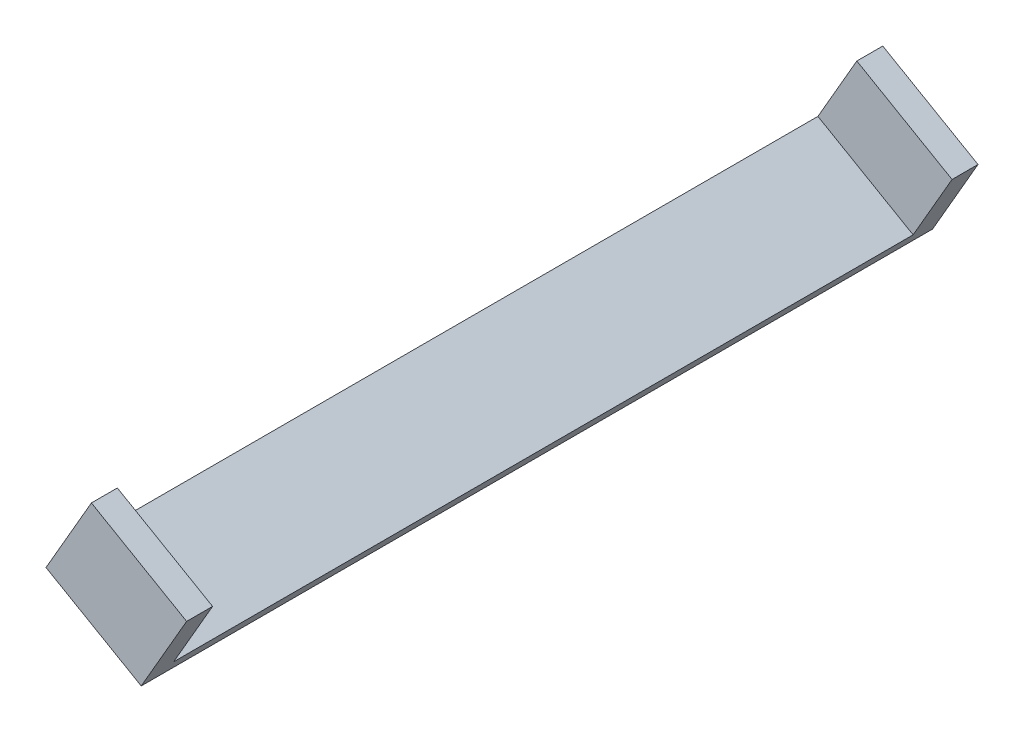
ISO-10303-21;
HEADER;
FILE_DESCRIPTION(('STEP AP214'),'2;1');
FILE_NAME('part.step','',(''),(''),'','','');
FILE_SCHEMA(('AUTOMOTIVE_DESIGN { 1 0 10303 214 1 1 1 1 }'));
ENDSEC;
DATA;
#1=APPLICATION_CONTEXT('core data for automotive mechanical design processes');
#2=APPLICATION_PROTOCOL_DEFINITION('international standard','automotive_design',2000,#1);
#3=PRODUCT_CONTEXT('',#1,'mechanical');
#4=PRODUCT('Part','Part','',(#3));
#5=PRODUCT_RELATED_PRODUCT_CATEGORY('part','',(#4));
#6=PRODUCT_DEFINITION_FORMATION('','',#4);
#7=PRODUCT_DEFINITION_CONTEXT('part definition',#1,'design');
#8=PRODUCT_DEFINITION('design','',#6,#7);
#9=PRODUCT_DEFINITION_SHAPE('','',#8);
#10=(LENGTH_UNIT() NAMED_UNIT(*) SI_UNIT(.MILLI.,.METRE.));
#11=(NAMED_UNIT(*) PLANE_ANGLE_UNIT() SI_UNIT($,.RADIAN.));
#12=(NAMED_UNIT(*) SI_UNIT($,.STERADIAN.) SOLID_ANGLE_UNIT());
#13=UNCERTAINTY_MEASURE_WITH_UNIT(LENGTH_MEASURE(1.E-05),#10,'distance_accuracy_value','');
#14=(GEOMETRIC_REPRESENTATION_CONTEXT(3) GLOBAL_UNCERTAINTY_ASSIGNED_CONTEXT((#13)) GLOBAL_UNIT_ASSIGNED_CONTEXT((#10,
#11,#12)) REPRESENTATION_CONTEXT('',''));
#15=CARTESIAN_POINT('',(0.,0.,0.));
#16=DIRECTION('',(0.,0.,1.));
#17=DIRECTION('',(1.,0.,0.));
#18=AXIS2_PLACEMENT_3D('',#15,#16,#17);
#19=CARTESIAN_POINT('',(-136.8,248.875527592725,1220.));
#20=DIRECTION('',(-0.499999999999998,-0.86602540378444,0.));
#21=DIRECTION('',(0.86602540378444,-0.499999999999998,0.));
#22=AXIS2_PLACEMENT_3D('',#19,#20,#21);
#23=PLANE('',#22);
#24=DIRECTION('',(0.86602540378444,-0.499999999999998,0.));
#25=VECTOR('',#24,1.);
#26=CARTESIAN_POINT('',(-136.8,248.875527592725,40.));
#27=LINE('',#26,#25);
#28=CARTESIAN_POINT('',(-136.8,248.875527592725,40.));
#29=VERTEX_POINT('',#28);
#30=CARTESIAN_POINT('',(9.99999999999997,164.120508075689,40.));
#31=VERTEX_POINT('',#30);
#32=EDGE_CURVE('E55',#29,#31,#27,.T.);
#33=ORIENTED_EDGE('',*,*,#32,.F.);
#34=DIRECTION('',(0.,0.,-1.));
#35=VECTOR('',#34,1.);
#36=CARTESIAN_POINT('',(-136.8,248.875527592725,1220.));
#37=LINE('',#36,#35);
#38=CARTESIAN_POINT('',(-136.8,248.875527592725,1180.));
#39=VERTEX_POINT('',#38);
#40=EDGE_CURVE('E123',#39,#29,#37,.T.);
#41=ORIENTED_EDGE('',*,*,#40,.F.);
#42=DIRECTION('',(-0.86602540378444,0.499999999999998,0.));
#43=VECTOR('',#42,1.);
#44=CARTESIAN_POINT('',(-136.8,248.875527592725,1180.));
#45=LINE('',#44,#43);
#46=CARTESIAN_POINT('',(9.99999999999998,164.120508075689,1180.));
#47=VERTEX_POINT('',#46);
#48=EDGE_CURVE('E124',#47,#39,#45,.T.);
#49=ORIENTED_EDGE('',*,*,#48,.F.);
#50=DIRECTION('',(0.,0.,-1.));
#51=VECTOR('',#50,1.);
#52=CARTESIAN_POINT('',(9.99999999999997,164.120508075689,1220.));
#53=LINE('',#52,#51);
#54=EDGE_CURVE('E45',#47,#31,#53,.T.);
#55=ORIENTED_EDGE('',*,*,#54,.T.);
#56=EDGE_LOOP('',(#33,#41,#49,#55));
#57=FACE_BOUND('',#56,.T.);
#58=ADVANCED_FACE('F37',(#57),#23,.F.);
#59=CARTESIAN_POINT('',(0.,146.8,1220.));
#60=DIRECTION('',(0.499999999999998,0.86602540378444,0.));
#61=DIRECTION('',(-0.86602540378444,0.499999999999998,0.));
#62=AXIS2_PLACEMENT_3D('',#59,#60,#61);
#63=PLANE('',#62);
#64=DIRECTION('',(0.86602540378444,-0.499999999999998,0.));
#65=VECTOR('',#64,1.);
#66=CARTESIAN_POINT('',(0.,146.8,0.));
#67=LINE('',#66,#65);
#68=CARTESIAN_POINT('',(-146.8,231.555019517037,0.));
#69=VERTEX_POINT('',#68);
#70=CARTESIAN_POINT('',(0.,146.8,0.));
#71=VERTEX_POINT('',#70);
#72=EDGE_CURVE('E144',#69,#71,#67,.T.);
#73=ORIENTED_EDGE('',*,*,#72,.T.);
#74=DIRECTION('',(0.,0.,-1.));
#75=VECTOR('',#74,1.);
#76=CARTESIAN_POINT('',(0.,146.8,1220.));
#77=LINE('',#76,#75);
#78=CARTESIAN_POINT('',(0.,146.8,1220.));
#79=VERTEX_POINT('',#78);
#80=EDGE_CURVE('E11',#79,#71,#77,.T.);
#81=ORIENTED_EDGE('',*,*,#80,.F.);
#82=DIRECTION('',(0.86602540378444,-0.499999999999998,0.));
#83=VECTOR('',#82,1.);
#84=CARTESIAN_POINT('',(0.,146.8,1220.));
#85=LINE('',#84,#83);
#86=CARTESIAN_POINT('',(-146.8,231.555019517037,1220.));
#87=VERTEX_POINT('',#86);
#88=EDGE_CURVE('E145',#87,#79,#85,.T.);
#89=ORIENTED_EDGE('',*,*,#88,.F.);
#90=DIRECTION('',(0.,0.,-1.));
#91=VECTOR('',#90,1.);
#92=CARTESIAN_POINT('',(-146.8,231.555019517037,1220.));
#93=LINE('',#92,#91);
#94=EDGE_CURVE('E153',#87,#69,#93,.T.);
#95=ORIENTED_EDGE('',*,*,#94,.T.);
#96=EDGE_LOOP('',(#73,#81,#89,#95));
#97=FACE_BOUND('',#96,.T.);
#98=ADVANCED_FACE('F39',(#97),#63,.F.);
#99=CARTESIAN_POINT('',(0.,146.8,1220.));
#100=DIRECTION('',(-0.86602540378444,0.499999999999998,0.));
#101=DIRECTION('',(-0.499999999999998,-0.86602540378444,0.));
#102=AXIS2_PLACEMENT_3D('',#99,#100,#101);
#103=PLANE('',#102);
#104=DIRECTION('',(0.499999999999998,0.86602540378444,0.));
#105=VECTOR('',#104,1.);
#106=CARTESIAN_POINT('',(0.,146.8,0.));
#107=LINE('',#106,#105);
#108=CARTESIAN_POINT('',(69.9999999999997,268.043556529822,0.));
#109=VERTEX_POINT('',#108);
#110=EDGE_CURVE('E156',#71,#109,#107,.T.);
#111=ORIENTED_EDGE('',*,*,#110,.T.);
#112=DIRECTION('',(0.,0.,-1.));
#113=VECTOR('',#112,1.);
#114=CARTESIAN_POINT('',(69.9999999999997,268.043556529822,0.));
#115=LINE('',#114,#113);
#116=CARTESIAN_POINT('',(69.9999999999997,268.043556529822,40.));
#117=VERTEX_POINT('',#116);
#118=EDGE_CURVE('E111',#117,#109,#115,.T.);
#119=ORIENTED_EDGE('',*,*,#118,.F.);
#120=DIRECTION('',(-0.499999999999998,-0.86602540378444,0.));
#121=VECTOR('',#120,1.);
#122=CARTESIAN_POINT('',(69.9999999999997,268.043556529822,40.));
#123=LINE('',#122,#121);
#124=EDGE_CURVE('E107',#117,#31,#123,.T.);
#125=ORIENTED_EDGE('',*,*,#124,.T.);
#126=ORIENTED_EDGE('',*,*,#54,.F.);
#127=DIRECTION('',(-0.499999999999998,-0.86602540378444,0.));
#128=VECTOR('',#127,1.);
#129=CARTESIAN_POINT('',(69.9999999999997,268.043556529822,1180.));
#130=LINE('',#129,#128);
#131=CARTESIAN_POINT('',(69.9999999999997,268.043556529822,1180.));
#132=VERTEX_POINT('',#131);
#133=EDGE_CURVE('E142',#132,#47,#130,.T.);
#134=ORIENTED_EDGE('',*,*,#133,.F.);
#135=DIRECTION('',(0.,0.,-1.));
#136=VECTOR('',#135,1.);
#137=CARTESIAN_POINT('',(69.9999999999997,268.043556529822,1220.));
#138=LINE('',#137,#136);
#139=CARTESIAN_POINT('',(69.9999999999997,268.043556529822,1220.));
#140=VERTEX_POINT('',#139);
#141=EDGE_CURVE('E136',#140,#132,#138,.T.);
#142=ORIENTED_EDGE('',*,*,#141,.F.);
#143=DIRECTION('',(0.499999999999998,0.86602540378444,0.));
#144=VECTOR('',#143,1.);
#145=CARTESIAN_POINT('',(0.,146.8,1220.));
#146=LINE('',#145,#144);
#147=EDGE_CURVE('E148',#79,#140,#146,.T.);
#148=ORIENTED_EDGE('',*,*,#147,.F.);
#149=ORIENTED_EDGE('',*,*,#80,.T.);
#150=EDGE_LOOP('',(#111,#119,#125,#126,#134,#142,#148,#149));
#151=FACE_BOUND('',#150,.T.);
#152=ADVANCED_FACE('F169',(#151),#103,.F.);
#153=CARTESIAN_POINT('',(-146.8,231.555019517037,1220.));
#154=DIRECTION('',(0.86602540378444,-0.499999999999998,0.));
#155=DIRECTION('',(0.499999999999998,0.86602540378444,0.));
#156=AXIS2_PLACEMENT_3D('',#153,#154,#155);
#157=PLANE('',#156);
#158=DIRECTION('',(-0.499999999999998,-0.86602540378444,0.));
#159=VECTOR('',#158,1.);
#160=CARTESIAN_POINT('',(-146.8,231.555019517037,0.));
#161=LINE('',#160,#159);
#162=CARTESIAN_POINT('',(-76.8000000000003,352.798576046858,0.));
#163=VERTEX_POINT('',#162);
#164=EDGE_CURVE('E149',#163,#69,#161,.T.);
#165=ORIENTED_EDGE('',*,*,#164,.T.);
#166=ORIENTED_EDGE('',*,*,#94,.F.);
#167=DIRECTION('',(-0.499999999999998,-0.86602540378444,0.));
#168=VECTOR('',#167,1.);
#169=CARTESIAN_POINT('',(-146.8,231.555019517037,1220.));
#170=LINE('',#169,#168);
#171=CARTESIAN_POINT('',(-76.8000000000003,352.798576046858,1220.));
#172=VERTEX_POINT('',#171);
#173=EDGE_CURVE('E151',#172,#87,#170,.T.);
#174=ORIENTED_EDGE('',*,*,#173,.F.);
#175=DIRECTION('',(0.,0.,1.));
#176=VECTOR('',#175,1.);
#177=CARTESIAN_POINT('',(-76.8000000000003,352.798576046858,1220.));
#178=LINE('',#177,#176);
#179=CARTESIAN_POINT('',(-76.8000000000003,352.798576046858,1180.));
#180=VERTEX_POINT('',#179);
#181=EDGE_CURVE('E126',#180,#172,#178,.T.);
#182=ORIENTED_EDGE('',*,*,#181,.F.);
#183=DIRECTION('',(-0.499999999999998,-0.86602540378444,0.));
#184=VECTOR('',#183,1.);
#185=CARTESIAN_POINT('',(-76.8000000000003,352.798576046858,1180.));
#186=LINE('',#185,#184);
#187=EDGE_CURVE('E139',#180,#39,#186,.T.);
#188=ORIENTED_EDGE('',*,*,#187,.T.);
#189=ORIENTED_EDGE('',*,*,#40,.T.);
#190=DIRECTION('',(-0.499999999999998,-0.86602540378444,0.));
#191=VECTOR('',#190,1.);
#192=CARTESIAN_POINT('',(-76.8000000000003,352.798576046858,40.));
#193=LINE('',#192,#191);
#194=CARTESIAN_POINT('',(-76.8000000000003,352.798576046858,40.));
#195=VERTEX_POINT('',#194);
#196=EDGE_CURVE('E105',#195,#29,#193,.T.);
#197=ORIENTED_EDGE('',*,*,#196,.F.);
#198=DIRECTION('',(0.,0.,1.));
#199=VECTOR('',#198,1.);
#200=CARTESIAN_POINT('',(-76.8000000000003,352.798576046858,0.));
#201=LINE('',#200,#199);
#202=EDGE_CURVE('E112',#163,#195,#201,.T.);
#203=ORIENTED_EDGE('',*,*,#202,.F.);
#204=EDGE_LOOP('',(#165,#166,#174,#182,#188,#189,#197,#203));
#205=FACE_BOUND('',#204,.T.);
#206=ADVANCED_FACE('F121',(#205),#157,.F.);
#207=CARTESIAN_POINT('',(0.,0.,1220.));
#208=DIRECTION('',(0.,0.,-1.));
#209=DIRECTION('',(-1.,0.,0.));
#210=AXIS2_PLACEMENT_3D('',#207,#208,#209);
#211=PLANE('',#210);
#212=ORIENTED_EDGE('',*,*,#88,.T.);
#213=ORIENTED_EDGE('',*,*,#147,.T.);
#214=DIRECTION('',(0.86602540378444,-0.499999999999998,0.));
#215=VECTOR('',#214,1.);
#216=CARTESIAN_POINT('',(-76.8000000000003,352.798576046858,1220.));
#217=LINE('',#216,#215);
#218=EDGE_CURVE('E133',#172,#140,#217,.T.);
#219=ORIENTED_EDGE('',*,*,#218,.F.);
#220=ORIENTED_EDGE('',*,*,#173,.T.);
#221=EDGE_LOOP('',(#212,#213,#219,#220));
#222=FACE_BOUND('',#221,.T.);
#223=ADVANCED_FACE('F174',(#222),#211,.F.);
#224=CARTESIAN_POINT('',(0.,0.,0.));
#225=DIRECTION('',(0.,0.,-1.));
#226=DIRECTION('',(-1.,0.,0.));
#227=AXIS2_PLACEMENT_3D('',#224,#225,#226);
#228=PLANE('',#227);
#229=ORIENTED_EDGE('',*,*,#72,.F.);
#230=ORIENTED_EDGE('',*,*,#164,.F.);
#231=DIRECTION('',(-0.86602540378444,0.499999999999998,0.));
#232=VECTOR('',#231,1.);
#233=CARTESIAN_POINT('',(-76.8000000000003,352.798576046858,0.));
#234=LINE('',#233,#232);
#235=EDGE_CURVE('E118',#109,#163,#234,.T.);
#236=ORIENTED_EDGE('',*,*,#235,.F.);
#237=ORIENTED_EDGE('',*,*,#110,.F.);
#238=EDGE_LOOP('',(#229,#230,#236,#237));
#239=FACE_BOUND('',#238,.T.);
#240=ADVANCED_FACE('F167',(#239),#228,.T.);
#241=CARTESIAN_POINT('',(-76.8000000000003,352.798576046858,1180.));
#242=DIRECTION('',(0.,0.,1.));
#243=DIRECTION('',(1.,0.,0.));
#244=AXIS2_PLACEMENT_3D('',#241,#242,#243);
#245=PLANE('',#244);
#246=ORIENTED_EDGE('',*,*,#48,.T.);
#247=ORIENTED_EDGE('',*,*,#187,.F.);
#248=DIRECTION('',(-0.86602540378444,0.499999999999998,0.));
#249=VECTOR('',#248,1.);
#250=CARTESIAN_POINT('',(-76.8000000000003,352.798576046858,1180.));
#251=LINE('',#250,#249);
#252=EDGE_CURVE('E138',#132,#180,#251,.T.);
#253=ORIENTED_EDGE('',*,*,#252,.F.);
#254=ORIENTED_EDGE('',*,*,#133,.T.);
#255=EDGE_LOOP('',(#246,#247,#253,#254));
#256=FACE_BOUND('',#255,.T.);
#257=ADVANCED_FACE('F181',(#256),#245,.F.);
#258=CARTESIAN_POINT('',(133.566264637777,231.343556529822,0.));
#259=DIRECTION('',(-0.499999999999998,-0.86602540378444,0.));
#260=DIRECTION('',(0.86602540378444,-0.499999999999998,0.));
#261=AXIS2_PLACEMENT_3D('',#258,#259,#260);
#262=PLANE('',#261);
#263=ORIENTED_EDGE('',*,*,#181,.T.);
#264=ORIENTED_EDGE('',*,*,#218,.T.);
#265=ORIENTED_EDGE('',*,*,#141,.T.);
#266=ORIENTED_EDGE('',*,*,#252,.T.);
#267=EDGE_LOOP('',(#263,#264,#265,#266));
#268=FACE_BOUND('',#267,.T.);
#269=ADVANCED_FACE('F178',(#268),#262,.F.);
#270=CARTESIAN_POINT('',(-76.8000000000003,352.798576046858,40.));
#271=DIRECTION('',(0.,0.,-1.));
#272=DIRECTION('',(-1.,0.,0.));
#273=AXIS2_PLACEMENT_3D('',#270,#271,#272);
#274=PLANE('',#273);
#275=ORIENTED_EDGE('',*,*,#32,.T.);
#276=ORIENTED_EDGE('',*,*,#124,.F.);
#277=DIRECTION('',(0.86602540378444,-0.499999999999998,0.));
#278=VECTOR('',#277,1.);
#279=CARTESIAN_POINT('',(-76.8000000000003,352.798576046858,40.));
#280=LINE('',#279,#278);
#281=EDGE_CURVE('E101',#195,#117,#280,.T.);
#282=ORIENTED_EDGE('',*,*,#281,.F.);
#283=ORIENTED_EDGE('',*,*,#196,.T.);
#284=EDGE_LOOP('',(#275,#276,#282,#283));
#285=FACE_BOUND('',#284,.T.);
#286=ADVANCED_FACE('F103',(#285),#274,.F.);
#287=CARTESIAN_POINT('',(133.566264637777,231.343556529822,0.));
#288=DIRECTION('',(0.499999999999998,0.86602540378444,0.));
#289=DIRECTION('',(-0.86602540378444,0.499999999999998,0.));
#290=AXIS2_PLACEMENT_3D('',#287,#288,#289);
#291=PLANE('',#290);
#292=ORIENTED_EDGE('',*,*,#202,.T.);
#293=ORIENTED_EDGE('',*,*,#281,.T.);
#294=ORIENTED_EDGE('',*,*,#118,.T.);
#295=ORIENTED_EDGE('',*,*,#235,.T.);
#296=EDGE_LOOP('',(#292,#293,#294,#295));
#297=FACE_BOUND('',#296,.T.);
#298=ADVANCED_FACE('F116',(#297),#291,.T.);
#299=CLOSED_SHELL('',(#58,#98,#152,#206,#223,#240,#257,#269,#286,#298));
#300=MANIFOLD_SOLID_BREP('B2',#299);
#301=ADVANCED_BREP_SHAPE_REPRESENTATION('',(#18,#300),#14);
#302=SHAPE_DEFINITION_REPRESENTATION(#9,#301);
ENDSEC;
END-ISO-10303-21;
